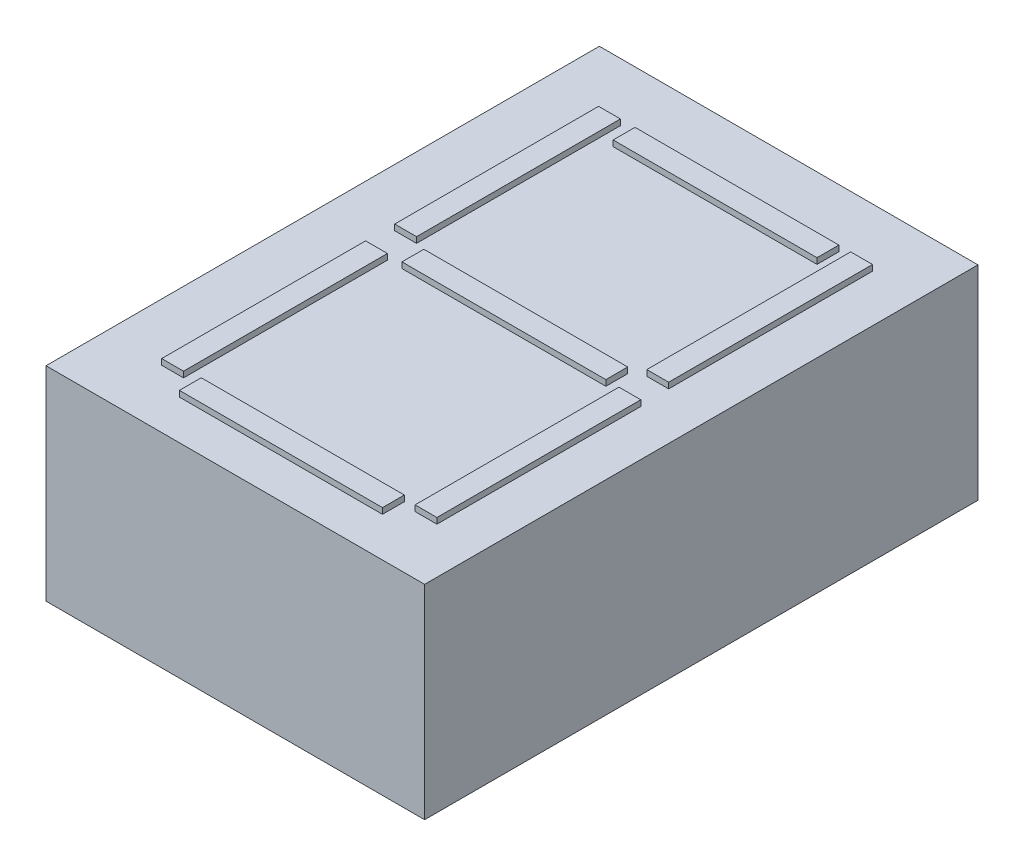
ISO-10303-21;
HEADER;
FILE_DESCRIPTION(('STEP AP214'),'2;1');
FILE_NAME('part.step','',(''),(''),'','','');
FILE_SCHEMA(('AUTOMOTIVE_DESIGN { 1 0 10303 214 1 1 1 1 }'));
ENDSEC;
DATA;
#1=APPLICATION_CONTEXT('core data for automotive mechanical design processes');
#2=APPLICATION_PROTOCOL_DEFINITION('international standard','automotive_design',2000,#1);
#3=PRODUCT_CONTEXT('',#1,'mechanical');
#4=PRODUCT('Part','Part','',(#3));
#5=PRODUCT_RELATED_PRODUCT_CATEGORY('part','',(#4));
#6=PRODUCT_DEFINITION_FORMATION('','',#4);
#7=PRODUCT_DEFINITION_CONTEXT('part definition',#1,'design');
#8=PRODUCT_DEFINITION('design','',#6,#7);
#9=PRODUCT_DEFINITION_SHAPE('','',#8);
#10=(LENGTH_UNIT() NAMED_UNIT(*) SI_UNIT(.MILLI.,.METRE.));
#11=(NAMED_UNIT(*) PLANE_ANGLE_UNIT() SI_UNIT($,.RADIAN.));
#12=(NAMED_UNIT(*) SI_UNIT($,.STERADIAN.) SOLID_ANGLE_UNIT());
#13=UNCERTAINTY_MEASURE_WITH_UNIT(LENGTH_MEASURE(1.E-05),#10,'distance_accuracy_value','');
#14=(GEOMETRIC_REPRESENTATION_CONTEXT(3) GLOBAL_UNCERTAINTY_ASSIGNED_CONTEXT((#13)) GLOBAL_UNIT_ASSIGNED_CONTEXT((#10,
#11,#12)) REPRESENTATION_CONTEXT('',''));
#15=CARTESIAN_POINT('',(0.,0.,0.));
#16=DIRECTION('',(0.,0.,1.));
#17=DIRECTION('',(1.,0.,0.));
#18=AXIS2_PLACEMENT_3D('',#15,#16,#17);
#19=CARTESIAN_POINT('',(0.,7.,0.));
#20=DIRECTION('',(0.,1.,0.));
#21=DIRECTION('',(0.,0.,1.));
#22=AXIS2_PLACEMENT_3D('',#19,#20,#21);
#23=PLANE('',#22);
#24=DIRECTION('',(0.,0.,1.));
#25=VECTOR('',#24,1.);
#26=CARTESIAN_POINT('',(0.,7.,-0.136469353779253));
#27=LINE('',#26,#25);
#28=CARTESIAN_POINT('',(0.,7.,-0.136469353779253));
#29=VERTEX_POINT('',#28);
#30=CARTESIAN_POINT('',(0.,7.,18.8635306462207));
#31=VERTEX_POINT('',#30);
#32=EDGE_CURVE('E447',#29,#31,#27,.T.);
#33=ORIENTED_EDGE('',*,*,#32,.T.);
#34=DIRECTION('',(1.,0.,0.));
#35=VECTOR('',#34,1.);
#36=CARTESIAN_POINT('',(0.,7.,18.8635306462207));
#37=LINE('',#36,#35);
#38=CARTESIAN_POINT('',(13.,7.,18.8635306462207));
#39=VERTEX_POINT('',#38);
#40=EDGE_CURVE('E450',#31,#39,#37,.T.);
#41=ORIENTED_EDGE('',*,*,#40,.T.);
#42=DIRECTION('',(0.,0.,-1.));
#43=VECTOR('',#42,1.);
#44=CARTESIAN_POINT('',(13.,7.,-0.136469353779253));
#45=LINE('',#44,#43);
#46=CARTESIAN_POINT('',(13.,7.,-0.136469353779253));
#47=VERTEX_POINT('',#46);
#48=EDGE_CURVE('E453',#39,#47,#45,.T.);
#49=ORIENTED_EDGE('',*,*,#48,.T.);
#50=DIRECTION('',(-1.,0.,0.));
#51=VECTOR('',#50,1.);
#52=CARTESIAN_POINT('',(0.,7.,-0.136469353779253));
#53=LINE('',#52,#51);
#54=EDGE_CURVE('E455',#47,#29,#53,.T.);
#55=ORIENTED_EDGE('',*,*,#54,.T.);
#56=EDGE_LOOP('',(#33,#41,#49,#55));
#57=FACE_BOUND('',#56,.T.);
#58=DIRECTION('',(1.,0.,0.));
#59=VECTOR('',#58,1.);
#60=CARTESIAN_POINT('',(3.22270214278411,7.,2.61353064622075));
#61=LINE('',#60,#59);
#62=CARTESIAN_POINT('',(3.22270214278411,7.,2.61353064622075));
#63=VERTEX_POINT('',#62);
#64=CARTESIAN_POINT('',(10.2227021427841,7.,2.61353064622075));
#65=VERTEX_POINT('',#64);
#66=EDGE_CURVE('E431',#63,#65,#61,.T.);
#67=ORIENTED_EDGE('',*,*,#66,.F.);
#68=DIRECTION('',(0.,0.,1.));
#69=VECTOR('',#68,1.);
#70=CARTESIAN_POINT('',(3.22270214278411,7.,1.86353064622075));
#71=LINE('',#70,#69);
#72=CARTESIAN_POINT('',(3.22270214278411,7.,1.86353064622075));
#73=VERTEX_POINT('',#72);
#74=EDGE_CURVE('E417',#73,#63,#71,.T.);
#75=ORIENTED_EDGE('',*,*,#74,.F.);
#76=DIRECTION('',(-1.,0.,0.));
#77=VECTOR('',#76,1.);
#78=CARTESIAN_POINT('',(3.22270214278411,7.,1.86353064622075));
#79=LINE('',#78,#77);
#80=CARTESIAN_POINT('',(10.2227021427841,7.,1.86353064622075));
#81=VERTEX_POINT('',#80);
#82=EDGE_CURVE('E422',#81,#73,#79,.T.);
#83=ORIENTED_EDGE('',*,*,#82,.F.);
#84=DIRECTION('',(0.,0.,-1.));
#85=VECTOR('',#84,1.);
#86=CARTESIAN_POINT('',(10.2227021427841,7.,1.86353064622075));
#87=LINE('',#86,#85);
#88=EDGE_CURVE('E433',#65,#81,#87,.T.);
#89=ORIENTED_EDGE('',*,*,#88,.F.);
#90=EDGE_LOOP('',(#67,#75,#83,#89));
#91=FACE_BOUND('',#90,.T.);
#92=DIRECTION('',(1.,0.,0.));
#93=VECTOR('',#92,1.);
#94=CARTESIAN_POINT('',(1.97270214278411,7.,8.86353064622075));
#95=LINE('',#94,#93);
#96=CARTESIAN_POINT('',(1.97270214278411,7.,8.86353064622075));
#97=VERTEX_POINT('',#96);
#98=CARTESIAN_POINT('',(2.72270214278411,7.,8.86353064622075));
#99=VERTEX_POINT('',#98);
#100=EDGE_CURVE('E402',#97,#99,#95,.T.);
#101=ORIENTED_EDGE('',*,*,#100,.F.);
#102=DIRECTION('',(0.,0.,1.));
#103=VECTOR('',#102,1.);
#104=CARTESIAN_POINT('',(1.97270214278411,7.,1.86353064622075));
#105=LINE('',#104,#103);
#106=CARTESIAN_POINT('',(1.97270214278411,7.,1.86353064622075));
#107=VERTEX_POINT('',#106);
#108=EDGE_CURVE('E388',#107,#97,#105,.T.);
#109=ORIENTED_EDGE('',*,*,#108,.F.);
#110=DIRECTION('',(-1.,0.,0.));
#111=VECTOR('',#110,1.);
#112=CARTESIAN_POINT('',(1.97270214278411,7.,1.86353064622075));
#113=LINE('',#112,#111);
#114=CARTESIAN_POINT('',(2.72270214278411,7.,1.86353064622075));
#115=VERTEX_POINT('',#114);
#116=EDGE_CURVE('E393',#115,#107,#113,.T.);
#117=ORIENTED_EDGE('',*,*,#116,.F.);
#118=DIRECTION('',(0.,0.,-1.));
#119=VECTOR('',#118,1.);
#120=CARTESIAN_POINT('',(2.72270214278411,7.,1.86353064622075));
#121=LINE('',#120,#119);
#122=EDGE_CURVE('E404',#99,#115,#121,.T.);
#123=ORIENTED_EDGE('',*,*,#122,.F.);
#124=EDGE_LOOP('',(#101,#109,#117,#123));
#125=FACE_BOUND('',#124,.T.);
#126=DIRECTION('',(1.,0.,0.));
#127=VECTOR('',#126,1.);
#128=CARTESIAN_POINT('',(10.6282511794807,7.,8.86353064622075));
#129=LINE('',#128,#127);
#130=CARTESIAN_POINT('',(10.6282511794807,7.,8.86353064622075));
#131=VERTEX_POINT('',#130);
#132=CARTESIAN_POINT('',(11.3782511794807,7.,8.86353064622075));
#133=VERTEX_POINT('',#132);
#134=EDGE_CURVE('E373',#131,#133,#129,.T.);
#135=ORIENTED_EDGE('',*,*,#134,.F.);
#136=DIRECTION('',(0.,0.,1.));
#137=VECTOR('',#136,1.);
#138=CARTESIAN_POINT('',(10.6282511794807,7.,1.86353064622075));
#139=LINE('',#138,#137);
#140=CARTESIAN_POINT('',(10.6282511794807,7.,1.86353064622075));
#141=VERTEX_POINT('',#140);
#142=EDGE_CURVE('E359',#141,#131,#139,.T.);
#143=ORIENTED_EDGE('',*,*,#142,.F.);
#144=DIRECTION('',(-1.,0.,0.));
#145=VECTOR('',#144,1.);
#146=CARTESIAN_POINT('',(10.6282511794807,7.,1.86353064622075));
#147=LINE('',#146,#145);
#148=CARTESIAN_POINT('',(11.3782511794807,7.,1.86353064622075));
#149=VERTEX_POINT('',#148);
#150=EDGE_CURVE('E364',#149,#141,#147,.T.);
#151=ORIENTED_EDGE('',*,*,#150,.F.);
#152=DIRECTION('',(0.,0.,-1.));
#153=VECTOR('',#152,1.);
#154=CARTESIAN_POINT('',(11.3782511794807,7.,1.86353064622075));
#155=LINE('',#154,#153);
#156=EDGE_CURVE('E375',#133,#149,#155,.T.);
#157=ORIENTED_EDGE('',*,*,#156,.F.);
#158=EDGE_LOOP('',(#135,#143,#151,#157));
#159=FACE_BOUND('',#158,.T.);
#160=DIRECTION('',(1.,0.,0.));
#161=VECTOR('',#160,1.);
#162=CARTESIAN_POINT('',(3.22270214278411,7.,9.86353064622075));
#163=LINE('',#162,#161);
#164=CARTESIAN_POINT('',(3.22270214278411,7.,9.86353064622075));
#165=VERTEX_POINT('',#164);
#166=CARTESIAN_POINT('',(10.2227021427841,7.,9.86353064622075));
#167=VERTEX_POINT('',#166);
#168=EDGE_CURVE('E344',#165,#167,#163,.T.);
#169=ORIENTED_EDGE('',*,*,#168,.F.);
#170=DIRECTION('',(0.,0.,1.));
#171=VECTOR('',#170,1.);
#172=CARTESIAN_POINT('',(3.22270214278411,7.,9.11353064622075));
#173=LINE('',#172,#171);
#174=CARTESIAN_POINT('',(3.22270214278411,7.,9.11353064622075));
#175=VERTEX_POINT('',#174);
#176=EDGE_CURVE('E330',#175,#165,#173,.T.);
#177=ORIENTED_EDGE('',*,*,#176,.F.);
#178=DIRECTION('',(-1.,0.,0.));
#179=VECTOR('',#178,1.);
#180=CARTESIAN_POINT('',(3.22270214278411,7.,9.11353064622075));
#181=LINE('',#180,#179);
#182=CARTESIAN_POINT('',(10.2227021427841,7.,9.11353064622075));
#183=VERTEX_POINT('',#182);
#184=EDGE_CURVE('E335',#183,#175,#181,.T.);
#185=ORIENTED_EDGE('',*,*,#184,.F.);
#186=DIRECTION('',(0.,0.,-1.));
#187=VECTOR('',#186,1.);
#188=CARTESIAN_POINT('',(10.2227021427841,7.,9.11353064622075));
#189=LINE('',#188,#187);
#190=EDGE_CURVE('E346',#167,#183,#189,.T.);
#191=ORIENTED_EDGE('',*,*,#190,.F.);
#192=EDGE_LOOP('',(#169,#177,#185,#191));
#193=FACE_BOUND('',#192,.T.);
#194=DIRECTION('',(-1.,0.,0.));
#195=VECTOR('',#194,1.);
#196=CARTESIAN_POINT('',(2.72270214278411,7.,9.86353064622075));
#197=LINE('',#196,#195);
#198=CARTESIAN_POINT('',(2.72270214278411,7.,9.86353064622075));
#199=VERTEX_POINT('',#198);
#200=CARTESIAN_POINT('',(1.97270214278411,7.,9.86353064622075));
#201=VERTEX_POINT('',#200);
#202=EDGE_CURVE('E315',#199,#201,#197,.T.);
#203=ORIENTED_EDGE('',*,*,#202,.F.);
#204=DIRECTION('',(0.,0.,-1.));
#205=VECTOR('',#204,1.);
#206=CARTESIAN_POINT('',(2.72270214278411,7.,9.86353064622075));
#207=LINE('',#206,#205);
#208=CARTESIAN_POINT('',(2.72270214278411,7.,16.8635306462208));
#209=VERTEX_POINT('',#208);
#210=EDGE_CURVE('E301',#209,#199,#207,.T.);
#211=ORIENTED_EDGE('',*,*,#210,.F.);
#212=DIRECTION('',(1.,0.,0.));
#213=VECTOR('',#212,1.);
#214=CARTESIAN_POINT('',(2.72270214278411,7.,16.8635306462208));
#215=LINE('',#214,#213);
#216=CARTESIAN_POINT('',(1.97270214278411,7.,16.8635306462208));
#217=VERTEX_POINT('',#216);
#218=EDGE_CURVE('E306',#217,#209,#215,.T.);
#219=ORIENTED_EDGE('',*,*,#218,.F.);
#220=DIRECTION('',(0.,0.,1.));
#221=VECTOR('',#220,1.);
#222=CARTESIAN_POINT('',(1.97270214278411,7.,9.86353064622075));
#223=LINE('',#222,#221);
#224=EDGE_CURVE('E317',#201,#217,#223,.T.);
#225=ORIENTED_EDGE('',*,*,#224,.F.);
#226=EDGE_LOOP('',(#203,#211,#219,#225));
#227=FACE_BOUND('',#226,.T.);
#228=DIRECTION('',(1.,0.,0.));
#229=VECTOR('',#228,1.);
#230=CARTESIAN_POINT('',(3.22270214278411,7.,17.505647722764));
#231=LINE('',#230,#229);
#232=CARTESIAN_POINT('',(3.22270214278411,7.,17.505647722764));
#233=VERTEX_POINT('',#232);
#234=CARTESIAN_POINT('',(10.1949748117781,7.,17.505647722764));
#235=VERTEX_POINT('',#234);
#236=EDGE_CURVE('E273',#233,#235,#231,.T.);
#237=ORIENTED_EDGE('',*,*,#236,.F.);
#238=DIRECTION('',(0.,0.,1.));
#239=VECTOR('',#238,1.);
#240=CARTESIAN_POINT('',(3.22270214278411,7.,16.755647722764));
#241=LINE('',#240,#239);
#242=CARTESIAN_POINT('',(3.22270214278411,7.,16.755647722764));
#243=VERTEX_POINT('',#242);
#244=EDGE_CURVE('E270',#243,#233,#241,.T.);
#245=ORIENTED_EDGE('',*,*,#244,.F.);
#246=DIRECTION('',(-1.,0.,0.));
#247=VECTOR('',#246,1.);
#248=CARTESIAN_POINT('',(3.22270214278411,7.,16.755647722764));
#249=LINE('',#248,#247);
#250=CARTESIAN_POINT('',(10.1949748117781,7.,16.755647722764));
#251=VERTEX_POINT('',#250);
#252=EDGE_CURVE('E282',#251,#243,#249,.T.);
#253=ORIENTED_EDGE('',*,*,#252,.F.);
#254=DIRECTION('',(0.,0.,-1.));
#255=VECTOR('',#254,1.);
#256=CARTESIAN_POINT('',(10.1949748117781,7.,16.755647722764));
#257=LINE('',#256,#255);
#258=EDGE_CURVE('E290',#235,#251,#257,.T.);
#259=ORIENTED_EDGE('',*,*,#258,.F.);
#260=EDGE_LOOP('',(#237,#245,#253,#259));
#261=FACE_BOUND('',#260,.T.);
#262=DIRECTION('',(1.,0.,0.));
#263=VECTOR('',#262,1.);
#264=CARTESIAN_POINT('',(10.6727021427841,7.,16.8635306462207));
#265=LINE('',#264,#263);
#266=CARTESIAN_POINT('',(10.6727021427841,7.,16.8635306462207));
#267=VERTEX_POINT('',#266);
#268=CARTESIAN_POINT('',(11.4227021427841,7.,16.8635306462207));
#269=VERTEX_POINT('',#268);
#270=EDGE_CURVE('E869',#267,#269,#265,.T.);
#271=ORIENTED_EDGE('',*,*,#270,.F.);
#272=DIRECTION('',(0.,0.,1.));
#273=VECTOR('',#272,1.);
#274=CARTESIAN_POINT('',(10.6727021427841,7.,9.86353064622075));
#275=LINE('',#274,#273);
#276=CARTESIAN_POINT('',(10.6727021427841,7.,9.86353064622075));
#277=VERTEX_POINT('',#276);
#278=EDGE_CURVE('E268',#277,#267,#275,.T.);
#279=ORIENTED_EDGE('',*,*,#278,.F.);
#280=DIRECTION('',(-1.,0.,0.));
#281=VECTOR('',#280,1.);
#282=CARTESIAN_POINT('',(10.6727021427841,7.,9.86353064622075));
#283=LINE('',#282,#281);
#284=CARTESIAN_POINT('',(11.4227021427841,7.,9.86353064622075));
#285=VERTEX_POINT('',#284);
#286=EDGE_CURVE('E264',#285,#277,#283,.T.);
#287=ORIENTED_EDGE('',*,*,#286,.F.);
#288=DIRECTION('',(0.,0.,-1.));
#289=VECTOR('',#288,1.);
#290=CARTESIAN_POINT('',(11.4227021427841,7.,9.86353064622075));
#291=LINE('',#290,#289);
#292=EDGE_CURVE('E866',#269,#285,#291,.T.);
#293=ORIENTED_EDGE('',*,*,#292,.F.);
#294=EDGE_LOOP('',(#271,#279,#287,#293));
#295=FACE_BOUND('',#294,.T.);
#296=ADVANCED_FACE('F35',(#57,#91,#125,#159,#193,#227,#261,#295),#23,.T.);
#297=CARTESIAN_POINT('',(0.,7.,-0.136469353779253));
#298=DIRECTION('',(1.,0.,0.));
#299=DIRECTION('',(0.,0.,-1.));
#300=AXIS2_PLACEMENT_3D('',#297,#298,#299);
#301=PLANE('',#300);
#302=DIRECTION('',(0.,0.,1.));
#303=VECTOR('',#302,1.);
#304=CARTESIAN_POINT('',(0.,0.,-0.136469353779253));
#305=LINE('',#304,#303);
#306=CARTESIAN_POINT('',(0.,0.,-0.136469353779253));
#307=VERTEX_POINT('',#306);
#308=CARTESIAN_POINT('',(0.,0.,18.8635306462207));
#309=VERTEX_POINT('',#308);
#310=EDGE_CURVE('E446',#307,#309,#305,.T.);
#311=ORIENTED_EDGE('',*,*,#310,.T.);
#312=DIRECTION('',(0.,-1.,0.));
#313=VECTOR('',#312,1.);
#314=CARTESIAN_POINT('',(0.,7.,18.8635306462207));
#315=LINE('',#314,#313);
#316=EDGE_CURVE('E11',#31,#309,#315,.T.);
#317=ORIENTED_EDGE('',*,*,#316,.F.);
#318=ORIENTED_EDGE('',*,*,#32,.F.);
#319=DIRECTION('',(0.,-1.,0.));
#320=VECTOR('',#319,1.);
#321=CARTESIAN_POINT('',(0.,7.,-0.136469353779253));
#322=LINE('',#321,#320);
#323=EDGE_CURVE('E457',#29,#307,#322,.T.);
#324=ORIENTED_EDGE('',*,*,#323,.T.);
#325=EDGE_LOOP('',(#311,#317,#318,#324));
#326=FACE_BOUND('',#325,.T.);
#327=ADVANCED_FACE('F37',(#326),#301,.F.);
#328=CARTESIAN_POINT('',(0.,7.,18.8635306462207));
#329=DIRECTION('',(0.,0.,-1.));
#330=DIRECTION('',(-1.,0.,0.));
#331=AXIS2_PLACEMENT_3D('',#328,#329,#330);
#332=PLANE('',#331);
#333=DIRECTION('',(1.,0.,0.));
#334=VECTOR('',#333,1.);
#335=CARTESIAN_POINT('',(0.,0.,18.8635306462207));
#336=LINE('',#335,#334);
#337=CARTESIAN_POINT('',(13.,0.,18.8635306462207));
#338=VERTEX_POINT('',#337);
#339=EDGE_CURVE('E460',#309,#338,#336,.T.);
#340=ORIENTED_EDGE('',*,*,#339,.T.);
#341=DIRECTION('',(0.,-1.,0.));
#342=VECTOR('',#341,1.);
#343=CARTESIAN_POINT('',(13.,7.,18.8635306462207));
#344=LINE('',#343,#342);
#345=EDGE_CURVE('E43',#39,#338,#344,.T.);
#346=ORIENTED_EDGE('',*,*,#345,.F.);
#347=ORIENTED_EDGE('',*,*,#40,.F.);
#348=ORIENTED_EDGE('',*,*,#316,.T.);
#349=EDGE_LOOP('',(#340,#346,#347,#348));
#350=FACE_BOUND('',#349,.T.);
#351=ADVANCED_FACE('F490',(#350),#332,.F.);
#352=CARTESIAN_POINT('',(13.,7.,-0.136469353779253));
#353=DIRECTION('',(-1.,0.,0.));
#354=DIRECTION('',(0.,0.,1.));
#355=AXIS2_PLACEMENT_3D('',#352,#353,#354);
#356=PLANE('',#355);
#357=DIRECTION('',(0.,0.,-1.));
#358=VECTOR('',#357,1.);
#359=CARTESIAN_POINT('',(13.,0.,-0.136469353779253));
#360=LINE('',#359,#358);
#361=CARTESIAN_POINT('',(13.,0.,-0.136469353779253));
#362=VERTEX_POINT('',#361);
#363=EDGE_CURVE('E462',#338,#362,#360,.T.);
#364=ORIENTED_EDGE('',*,*,#363,.T.);
#365=DIRECTION('',(0.,-1.,0.));
#366=VECTOR('',#365,1.);
#367=CARTESIAN_POINT('',(13.,7.,-0.136469353779253));
#368=LINE('',#367,#366);
#369=EDGE_CURVE('E467',#47,#362,#368,.T.);
#370=ORIENTED_EDGE('',*,*,#369,.F.);
#371=ORIENTED_EDGE('',*,*,#48,.F.);
#372=ORIENTED_EDGE('',*,*,#345,.T.);
#373=EDGE_LOOP('',(#364,#370,#371,#372));
#374=FACE_BOUND('',#373,.T.);
#375=ADVANCED_FACE('F474',(#374),#356,.F.);
#376=CARTESIAN_POINT('',(0.,7.,-0.136469353779253));
#377=DIRECTION('',(0.,0.,1.));
#378=DIRECTION('',(1.,0.,0.));
#379=AXIS2_PLACEMENT_3D('',#376,#377,#378);
#380=PLANE('',#379);
#381=DIRECTION('',(-1.,0.,0.));
#382=VECTOR('',#381,1.);
#383=CARTESIAN_POINT('',(0.,0.,-0.136469353779253));
#384=LINE('',#383,#382);
#385=EDGE_CURVE('E451',#362,#307,#384,.T.);
#386=ORIENTED_EDGE('',*,*,#385,.T.);
#387=ORIENTED_EDGE('',*,*,#323,.F.);
#388=ORIENTED_EDGE('',*,*,#54,.F.);
#389=ORIENTED_EDGE('',*,*,#369,.T.);
#390=EDGE_LOOP('',(#386,#387,#388,#389));
#391=FACE_BOUND('',#390,.T.);
#392=ADVANCED_FACE('F483',(#391),#380,.F.);
#393=CARTESIAN_POINT('',(0.,0.,0.));
#394=DIRECTION('',(0.,1.,0.));
#395=DIRECTION('',(0.,0.,1.));
#396=AXIS2_PLACEMENT_3D('',#393,#394,#395);
#397=PLANE('',#396);
#398=ORIENTED_EDGE('',*,*,#310,.F.);
#399=ORIENTED_EDGE('',*,*,#385,.F.);
#400=ORIENTED_EDGE('',*,*,#363,.F.);
#401=ORIENTED_EDGE('',*,*,#339,.F.);
#402=EDGE_LOOP('',(#398,#399,#400,#401));
#403=FACE_BOUND('',#402,.T.);
#404=ADVANCED_FACE('F480',(#403),#397,.F.);
#405=CARTESIAN_POINT('',(3.22270214278411,7.2,1.86353064622075));
#406=DIRECTION('',(1.,0.,0.));
#407=DIRECTION('',(0.,0.,-1.));
#408=AXIS2_PLACEMENT_3D('',#405,#406,#407);
#409=PLANE('',#408);
#410=ORIENTED_EDGE('',*,*,#74,.T.);
#411=DIRECTION('',(0.,-1.,0.));
#412=VECTOR('',#411,1.);
#413=CARTESIAN_POINT('',(3.22270214278411,7.2,2.61353064622075));
#414=LINE('',#413,#412);
#415=CARTESIAN_POINT('',(3.22270214278411,7.2,2.61353064622075));
#416=VERTEX_POINT('',#415);
#417=EDGE_CURVE('E444',#416,#63,#414,.T.);
#418=ORIENTED_EDGE('',*,*,#417,.F.);
#419=DIRECTION('',(0.,0.,1.));
#420=VECTOR('',#419,1.);
#421=CARTESIAN_POINT('',(3.22270214278411,7.2,1.86353064622075));
#422=LINE('',#421,#420);
#423=CARTESIAN_POINT('',(3.22270214278411,7.2,1.86353064622075));
#424=VERTEX_POINT('',#423);
#425=EDGE_CURVE('E418',#424,#416,#422,.T.);
#426=ORIENTED_EDGE('',*,*,#425,.F.);
#427=DIRECTION('',(0.,-1.,0.));
#428=VECTOR('',#427,1.);
#429=CARTESIAN_POINT('',(3.22270214278411,7.2,1.86353064622075));
#430=LINE('',#429,#428);
#431=EDGE_CURVE('E428',#424,#73,#430,.T.);
#432=ORIENTED_EDGE('',*,*,#431,.T.);
#433=EDGE_LOOP('',(#410,#418,#426,#432));
#434=FACE_BOUND('',#433,.T.);
#435=ADVANCED_FACE('F503',(#434),#409,.F.);
#436=CARTESIAN_POINT('',(3.22270214278411,7.2,2.61353064622075));
#437=DIRECTION('',(0.,0.,-1.));
#438=DIRECTION('',(-1.,0.,0.));
#439=AXIS2_PLACEMENT_3D('',#436,#437,#438);
#440=PLANE('',#439);
#441=ORIENTED_EDGE('',*,*,#66,.T.);
#442=DIRECTION('',(0.,-1.,0.));
#443=VECTOR('',#442,1.);
#444=CARTESIAN_POINT('',(10.2227021427841,7.2,2.61353064622075));
#445=LINE('',#444,#443);
#446=CARTESIAN_POINT('',(10.2227021427841,7.2,2.61353064622075));
#447=VERTEX_POINT('',#446);
#448=EDGE_CURVE('E441',#447,#65,#445,.T.);
#449=ORIENTED_EDGE('',*,*,#448,.F.);
#450=DIRECTION('',(1.,0.,0.));
#451=VECTOR('',#450,1.);
#452=CARTESIAN_POINT('',(3.22270214278411,7.2,2.61353064622075));
#453=LINE('',#452,#451);
#454=EDGE_CURVE('E421',#416,#447,#453,.T.);
#455=ORIENTED_EDGE('',*,*,#454,.F.);
#456=ORIENTED_EDGE('',*,*,#417,.T.);
#457=EDGE_LOOP('',(#441,#449,#455,#456));
#458=FACE_BOUND('',#457,.T.);
#459=ADVANCED_FACE('F528',(#458),#440,.F.);
#460=CARTESIAN_POINT('',(10.2227021427841,7.2,1.86353064622075));
#461=DIRECTION('',(-1.,0.,0.));
#462=DIRECTION('',(0.,0.,1.));
#463=AXIS2_PLACEMENT_3D('',#460,#461,#462);
#464=PLANE('',#463);
#465=ORIENTED_EDGE('',*,*,#88,.T.);
#466=DIRECTION('',(0.,-1.,0.));
#467=VECTOR('',#466,1.);
#468=CARTESIAN_POINT('',(10.2227021427841,7.2,1.86353064622075));
#469=LINE('',#468,#467);
#470=CARTESIAN_POINT('',(10.2227021427841,7.2,1.86353064622075));
#471=VERTEX_POINT('',#470);
#472=EDGE_CURVE('E439',#471,#81,#469,.T.);
#473=ORIENTED_EDGE('',*,*,#472,.F.);
#474=DIRECTION('',(0.,0.,-1.));
#475=VECTOR('',#474,1.);
#476=CARTESIAN_POINT('',(10.2227021427841,7.2,1.86353064622075));
#477=LINE('',#476,#475);
#478=EDGE_CURVE('E424',#447,#471,#477,.T.);
#479=ORIENTED_EDGE('',*,*,#478,.F.);
#480=ORIENTED_EDGE('',*,*,#448,.T.);
#481=EDGE_LOOP('',(#465,#473,#479,#480));
#482=FACE_BOUND('',#481,.T.);
#483=ADVANCED_FACE('F534',(#482),#464,.F.);
#484=CARTESIAN_POINT('',(3.22270214278411,7.2,1.86353064622075));
#485=DIRECTION('',(0.,0.,1.));
#486=DIRECTION('',(1.,0.,0.));
#487=AXIS2_PLACEMENT_3D('',#484,#485,#486);
#488=PLANE('',#487);
#489=ORIENTED_EDGE('',*,*,#82,.T.);
#490=ORIENTED_EDGE('',*,*,#431,.F.);
#491=DIRECTION('',(-1.,0.,0.));
#492=VECTOR('',#491,1.);
#493=CARTESIAN_POINT('',(3.22270214278411,7.2,1.86353064622075));
#494=LINE('',#493,#492);
#495=EDGE_CURVE('E426',#471,#424,#494,.T.);
#496=ORIENTED_EDGE('',*,*,#495,.F.);
#497=ORIENTED_EDGE('',*,*,#472,.T.);
#498=EDGE_LOOP('',(#489,#490,#496,#497));
#499=FACE_BOUND('',#498,.T.);
#500=ADVANCED_FACE('F541',(#499),#488,.F.);
#501=CARTESIAN_POINT('',(0.,7.2,0.));
#502=DIRECTION('',(0.,1.,0.));
#503=DIRECTION('',(0.,0.,1.));
#504=AXIS2_PLACEMENT_3D('',#501,#502,#503);
#505=PLANE('',#504);
#506=ORIENTED_EDGE('',*,*,#425,.T.);
#507=ORIENTED_EDGE('',*,*,#454,.T.);
#508=ORIENTED_EDGE('',*,*,#478,.T.);
#509=ORIENTED_EDGE('',*,*,#495,.T.);
#510=EDGE_LOOP('',(#506,#507,#508,#509));
#511=FACE_BOUND('',#510,.T.);
#512=ADVANCED_FACE('F549',(#511),#505,.T.);
#513=CARTESIAN_POINT('',(1.97270214278411,7.2,1.86353064622075));
#514=DIRECTION('',(1.,0.,0.));
#515=DIRECTION('',(0.,0.,-1.));
#516=AXIS2_PLACEMENT_3D('',#513,#514,#515);
#517=PLANE('',#516);
#518=ORIENTED_EDGE('',*,*,#108,.T.);
#519=DIRECTION('',(0.,-1.,0.));
#520=VECTOR('',#519,1.);
#521=CARTESIAN_POINT('',(1.97270214278411,7.2,8.86353064622075));
#522=LINE('',#521,#520);
#523=CARTESIAN_POINT('',(1.97270214278411,7.2,8.86353064622075));
#524=VERTEX_POINT('',#523);
#525=EDGE_CURVE('E415',#524,#97,#522,.T.);
#526=ORIENTED_EDGE('',*,*,#525,.F.);
#527=DIRECTION('',(0.,0.,1.));
#528=VECTOR('',#527,1.);
#529=CARTESIAN_POINT('',(1.97270214278411,7.2,1.86353064622075));
#530=LINE('',#529,#528);
#531=CARTESIAN_POINT('',(1.97270214278411,7.2,1.86353064622075));
#532=VERTEX_POINT('',#531);
#533=EDGE_CURVE('E389',#532,#524,#530,.T.);
#534=ORIENTED_EDGE('',*,*,#533,.F.);
#535=DIRECTION('',(0.,-1.,0.));
#536=VECTOR('',#535,1.);
#537=CARTESIAN_POINT('',(1.97270214278411,7.2,1.86353064622075));
#538=LINE('',#537,#536);
#539=EDGE_CURVE('E399',#532,#107,#538,.T.);
#540=ORIENTED_EDGE('',*,*,#539,.T.);
#541=EDGE_LOOP('',(#518,#526,#534,#540));
#542=FACE_BOUND('',#541,.T.);
#543=ADVANCED_FACE('F557',(#542),#517,.F.);
#544=CARTESIAN_POINT('',(1.97270214278411,7.2,8.86353064622075));
#545=DIRECTION('',(0.,0.,-1.));
#546=DIRECTION('',(-1.,0.,0.));
#547=AXIS2_PLACEMENT_3D('',#544,#545,#546);
#548=PLANE('',#547);
#549=ORIENTED_EDGE('',*,*,#100,.T.);
#550=DIRECTION('',(0.,-1.,0.));
#551=VECTOR('',#550,1.);
#552=CARTESIAN_POINT('',(2.72270214278411,7.2,8.86353064622075));
#553=LINE('',#552,#551);
#554=CARTESIAN_POINT('',(2.72270214278411,7.2,8.86353064622075));
#555=VERTEX_POINT('',#554);
#556=EDGE_CURVE('E412',#555,#99,#553,.T.);
#557=ORIENTED_EDGE('',*,*,#556,.F.);
#558=DIRECTION('',(1.,0.,0.));
#559=VECTOR('',#558,1.);
#560=CARTESIAN_POINT('',(1.97270214278411,7.2,8.86353064622075));
#561=LINE('',#560,#559);
#562=EDGE_CURVE('E392',#524,#555,#561,.T.);
#563=ORIENTED_EDGE('',*,*,#562,.F.);
#564=ORIENTED_EDGE('',*,*,#525,.T.);
#565=EDGE_LOOP('',(#549,#557,#563,#564));
#566=FACE_BOUND('',#565,.T.);
#567=ADVANCED_FACE('F565',(#566),#548,.F.);
#568=CARTESIAN_POINT('',(2.72270214278411,7.2,1.86353064622075));
#569=DIRECTION('',(-1.,0.,0.));
#570=DIRECTION('',(0.,0.,1.));
#571=AXIS2_PLACEMENT_3D('',#568,#569,#570);
#572=PLANE('',#571);
#573=ORIENTED_EDGE('',*,*,#122,.T.);
#574=DIRECTION('',(0.,-1.,0.));
#575=VECTOR('',#574,1.);
#576=CARTESIAN_POINT('',(2.72270214278411,7.2,1.86353064622075));
#577=LINE('',#576,#575);
#578=CARTESIAN_POINT('',(2.72270214278411,7.2,1.86353064622075));
#579=VERTEX_POINT('',#578);
#580=EDGE_CURVE('E410',#579,#115,#577,.T.);
#581=ORIENTED_EDGE('',*,*,#580,.F.);
#582=DIRECTION('',(0.,0.,-1.));
#583=VECTOR('',#582,1.);
#584=CARTESIAN_POINT('',(2.72270214278411,7.2,1.86353064622075));
#585=LINE('',#584,#583);
#586=EDGE_CURVE('E395',#555,#579,#585,.T.);
#587=ORIENTED_EDGE('',*,*,#586,.F.);
#588=ORIENTED_EDGE('',*,*,#556,.T.);
#589=EDGE_LOOP('',(#573,#581,#587,#588));
#590=FACE_BOUND('',#589,.T.);
#591=ADVANCED_FACE('F573',(#590),#572,.F.);
#592=CARTESIAN_POINT('',(1.97270214278411,7.2,1.86353064622075));
#593=DIRECTION('',(0.,0.,1.));
#594=DIRECTION('',(1.,0.,0.));
#595=AXIS2_PLACEMENT_3D('',#592,#593,#594);
#596=PLANE('',#595);
#597=ORIENTED_EDGE('',*,*,#116,.T.);
#598=ORIENTED_EDGE('',*,*,#539,.F.);
#599=DIRECTION('',(-1.,0.,0.));
#600=VECTOR('',#599,1.);
#601=CARTESIAN_POINT('',(1.97270214278411,7.2,1.86353064622075));
#602=LINE('',#601,#600);
#603=EDGE_CURVE('E397',#579,#532,#602,.T.);
#604=ORIENTED_EDGE('',*,*,#603,.F.);
#605=ORIENTED_EDGE('',*,*,#580,.T.);
#606=EDGE_LOOP('',(#597,#598,#604,#605));
#607=FACE_BOUND('',#606,.T.);
#608=ADVANCED_FACE('F581',(#607),#596,.F.);
#609=CARTESIAN_POINT('',(0.,7.2,0.));
#610=DIRECTION('',(0.,1.,0.));
#611=DIRECTION('',(0.,0.,1.));
#612=AXIS2_PLACEMENT_3D('',#609,#610,#611);
#613=PLANE('',#612);
#614=ORIENTED_EDGE('',*,*,#533,.T.);
#615=ORIENTED_EDGE('',*,*,#562,.T.);
#616=ORIENTED_EDGE('',*,*,#586,.T.);
#617=ORIENTED_EDGE('',*,*,#603,.T.);
#618=EDGE_LOOP('',(#614,#615,#616,#617));
#619=FACE_BOUND('',#618,.T.);
#620=ADVANCED_FACE('F589',(#619),#613,.T.);
#621=CARTESIAN_POINT('',(10.6282511794807,7.2,1.86353064622075));
#622=DIRECTION('',(1.,0.,0.));
#623=DIRECTION('',(0.,0.,-1.));
#624=AXIS2_PLACEMENT_3D('',#621,#622,#623);
#625=PLANE('',#624);
#626=ORIENTED_EDGE('',*,*,#142,.T.);
#627=DIRECTION('',(0.,-1.,0.));
#628=VECTOR('',#627,1.);
#629=CARTESIAN_POINT('',(10.6282511794807,7.2,8.86353064622075));
#630=LINE('',#629,#628);
#631=CARTESIAN_POINT('',(10.6282511794807,7.2,8.86353064622075));
#632=VERTEX_POINT('',#631);
#633=EDGE_CURVE('E386',#632,#131,#630,.T.);
#634=ORIENTED_EDGE('',*,*,#633,.F.);
#635=DIRECTION('',(0.,0.,1.));
#636=VECTOR('',#635,1.);
#637=CARTESIAN_POINT('',(10.6282511794807,7.2,1.86353064622075));
#638=LINE('',#637,#636);
#639=CARTESIAN_POINT('',(10.6282511794807,7.2,1.86353064622075));
#640=VERTEX_POINT('',#639);
#641=EDGE_CURVE('E360',#640,#632,#638,.T.);
#642=ORIENTED_EDGE('',*,*,#641,.F.);
#643=DIRECTION('',(0.,-1.,0.));
#644=VECTOR('',#643,1.);
#645=CARTESIAN_POINT('',(10.6282511794807,7.2,1.86353064622075));
#646=LINE('',#645,#644);
#647=EDGE_CURVE('E370',#640,#141,#646,.T.);
#648=ORIENTED_EDGE('',*,*,#647,.T.);
#649=EDGE_LOOP('',(#626,#634,#642,#648));
#650=FACE_BOUND('',#649,.T.);
#651=ADVANCED_FACE('F597',(#650),#625,.F.);
#652=CARTESIAN_POINT('',(10.6282511794807,7.2,8.86353064622075));
#653=DIRECTION('',(0.,0.,-1.));
#654=DIRECTION('',(-1.,0.,0.));
#655=AXIS2_PLACEMENT_3D('',#652,#653,#654);
#656=PLANE('',#655);
#657=ORIENTED_EDGE('',*,*,#134,.T.);
#658=DIRECTION('',(0.,-1.,0.));
#659=VECTOR('',#658,1.);
#660=CARTESIAN_POINT('',(11.3782511794807,7.2,8.86353064622075));
#661=LINE('',#660,#659);
#662=CARTESIAN_POINT('',(11.3782511794807,7.2,8.86353064622075));
#663=VERTEX_POINT('',#662);
#664=EDGE_CURVE('E383',#663,#133,#661,.T.);
#665=ORIENTED_EDGE('',*,*,#664,.F.);
#666=DIRECTION('',(1.,0.,0.));
#667=VECTOR('',#666,1.);
#668=CARTESIAN_POINT('',(10.6282511794807,7.2,8.86353064622075));
#669=LINE('',#668,#667);
#670=EDGE_CURVE('E363',#632,#663,#669,.T.);
#671=ORIENTED_EDGE('',*,*,#670,.F.);
#672=ORIENTED_EDGE('',*,*,#633,.T.);
#673=EDGE_LOOP('',(#657,#665,#671,#672));
#674=FACE_BOUND('',#673,.T.);
#675=ADVANCED_FACE('F605',(#674),#656,.F.);
#676=CARTESIAN_POINT('',(11.3782511794807,7.2,1.86353064622075));
#677=DIRECTION('',(-1.,0.,0.));
#678=DIRECTION('',(0.,0.,1.));
#679=AXIS2_PLACEMENT_3D('',#676,#677,#678);
#680=PLANE('',#679);
#681=ORIENTED_EDGE('',*,*,#156,.T.);
#682=DIRECTION('',(0.,-1.,0.));
#683=VECTOR('',#682,1.);
#684=CARTESIAN_POINT('',(11.3782511794807,7.2,1.86353064622075));
#685=LINE('',#684,#683);
#686=CARTESIAN_POINT('',(11.3782511794807,7.2,1.86353064622075));
#687=VERTEX_POINT('',#686);
#688=EDGE_CURVE('E381',#687,#149,#685,.T.);
#689=ORIENTED_EDGE('',*,*,#688,.F.);
#690=DIRECTION('',(0.,0.,-1.));
#691=VECTOR('',#690,1.);
#692=CARTESIAN_POINT('',(11.3782511794807,7.2,1.86353064622075));
#693=LINE('',#692,#691);
#694=EDGE_CURVE('E366',#663,#687,#693,.T.);
#695=ORIENTED_EDGE('',*,*,#694,.F.);
#696=ORIENTED_EDGE('',*,*,#664,.T.);
#697=EDGE_LOOP('',(#681,#689,#695,#696));
#698=FACE_BOUND('',#697,.T.);
#699=ADVANCED_FACE('F613',(#698),#680,.F.);
#700=CARTESIAN_POINT('',(10.6282511794807,7.2,1.86353064622075));
#701=DIRECTION('',(0.,0.,1.));
#702=DIRECTION('',(1.,0.,0.));
#703=AXIS2_PLACEMENT_3D('',#700,#701,#702);
#704=PLANE('',#703);
#705=ORIENTED_EDGE('',*,*,#150,.T.);
#706=ORIENTED_EDGE('',*,*,#647,.F.);
#707=DIRECTION('',(-1.,0.,0.));
#708=VECTOR('',#707,1.);
#709=CARTESIAN_POINT('',(10.6282511794807,7.2,1.86353064622075));
#710=LINE('',#709,#708);
#711=EDGE_CURVE('E368',#687,#640,#710,.T.);
#712=ORIENTED_EDGE('',*,*,#711,.F.);
#713=ORIENTED_EDGE('',*,*,#688,.T.);
#714=EDGE_LOOP('',(#705,#706,#712,#713));
#715=FACE_BOUND('',#714,.T.);
#716=ADVANCED_FACE('F621',(#715),#704,.F.);
#717=CARTESIAN_POINT('',(0.,7.2,0.));
#718=DIRECTION('',(0.,1.,0.));
#719=DIRECTION('',(0.,0.,1.));
#720=AXIS2_PLACEMENT_3D('',#717,#718,#719);
#721=PLANE('',#720);
#722=ORIENTED_EDGE('',*,*,#641,.T.);
#723=ORIENTED_EDGE('',*,*,#670,.T.);
#724=ORIENTED_EDGE('',*,*,#694,.T.);
#725=ORIENTED_EDGE('',*,*,#711,.T.);
#726=EDGE_LOOP('',(#722,#723,#724,#725));
#727=FACE_BOUND('',#726,.T.);
#728=ADVANCED_FACE('F629',(#727),#721,.T.);
#729=CARTESIAN_POINT('',(3.22270214278411,7.2,9.11353064622075));
#730=DIRECTION('',(1.,0.,0.));
#731=DIRECTION('',(0.,0.,-1.));
#732=AXIS2_PLACEMENT_3D('',#729,#730,#731);
#733=PLANE('',#732);
#734=ORIENTED_EDGE('',*,*,#176,.T.);
#735=DIRECTION('',(0.,-1.,0.));
#736=VECTOR('',#735,1.);
#737=CARTESIAN_POINT('',(3.22270214278411,7.2,9.86353064622075));
#738=LINE('',#737,#736);
#739=CARTESIAN_POINT('',(3.22270214278411,7.2,9.86353064622075));
#740=VERTEX_POINT('',#739);
#741=EDGE_CURVE('E357',#740,#165,#738,.T.);
#742=ORIENTED_EDGE('',*,*,#741,.F.);
#743=DIRECTION('',(0.,0.,1.));
#744=VECTOR('',#743,1.);
#745=CARTESIAN_POINT('',(3.22270214278411,7.2,9.11353064622075));
#746=LINE('',#745,#744);
#747=CARTESIAN_POINT('',(3.22270214278411,7.2,9.11353064622075));
#748=VERTEX_POINT('',#747);
#749=EDGE_CURVE('E331',#748,#740,#746,.T.);
#750=ORIENTED_EDGE('',*,*,#749,.F.);
#751=DIRECTION('',(0.,-1.,0.));
#752=VECTOR('',#751,1.);
#753=CARTESIAN_POINT('',(3.22270214278411,7.2,9.11353064622075));
#754=LINE('',#753,#752);
#755=EDGE_CURVE('E341',#748,#175,#754,.T.);
#756=ORIENTED_EDGE('',*,*,#755,.T.);
#757=EDGE_LOOP('',(#734,#742,#750,#756));
#758=FACE_BOUND('',#757,.T.);
#759=ADVANCED_FACE('F637',(#758),#733,.F.);
#760=CARTESIAN_POINT('',(3.22270214278411,7.2,9.86353064622075));
#761=DIRECTION('',(0.,0.,-1.));
#762=DIRECTION('',(-1.,0.,0.));
#763=AXIS2_PLACEMENT_3D('',#760,#761,#762);
#764=PLANE('',#763);
#765=ORIENTED_EDGE('',*,*,#168,.T.);
#766=DIRECTION('',(0.,-1.,0.));
#767=VECTOR('',#766,1.);
#768=CARTESIAN_POINT('',(10.2227021427841,7.2,9.86353064622075));
#769=LINE('',#768,#767);
#770=CARTESIAN_POINT('',(10.2227021427841,7.2,9.86353064622075));
#771=VERTEX_POINT('',#770);
#772=EDGE_CURVE('E354',#771,#167,#769,.T.);
#773=ORIENTED_EDGE('',*,*,#772,.F.);
#774=DIRECTION('',(1.,0.,0.));
#775=VECTOR('',#774,1.);
#776=CARTESIAN_POINT('',(3.22270214278411,7.2,9.86353064622075));
#777=LINE('',#776,#775);
#778=EDGE_CURVE('E334',#740,#771,#777,.T.);
#779=ORIENTED_EDGE('',*,*,#778,.F.);
#780=ORIENTED_EDGE('',*,*,#741,.T.);
#781=EDGE_LOOP('',(#765,#773,#779,#780));
#782=FACE_BOUND('',#781,.T.);
#783=ADVANCED_FACE('F645',(#782),#764,.F.);
#784=CARTESIAN_POINT('',(10.2227021427841,7.2,9.11353064622075));
#785=DIRECTION('',(-1.,0.,0.));
#786=DIRECTION('',(0.,0.,1.));
#787=AXIS2_PLACEMENT_3D('',#784,#785,#786);
#788=PLANE('',#787);
#789=ORIENTED_EDGE('',*,*,#190,.T.);
#790=DIRECTION('',(0.,-1.,0.));
#791=VECTOR('',#790,1.);
#792=CARTESIAN_POINT('',(10.2227021427841,7.2,9.11353064622075));
#793=LINE('',#792,#791);
#794=CARTESIAN_POINT('',(10.2227021427841,7.2,9.11353064622075));
#795=VERTEX_POINT('',#794);
#796=EDGE_CURVE('E352',#795,#183,#793,.T.);
#797=ORIENTED_EDGE('',*,*,#796,.F.);
#798=DIRECTION('',(0.,0.,-1.));
#799=VECTOR('',#798,1.);
#800=CARTESIAN_POINT('',(10.2227021427841,7.2,9.11353064622075));
#801=LINE('',#800,#799);
#802=EDGE_CURVE('E337',#771,#795,#801,.T.);
#803=ORIENTED_EDGE('',*,*,#802,.F.);
#804=ORIENTED_EDGE('',*,*,#772,.T.);
#805=EDGE_LOOP('',(#789,#797,#803,#804));
#806=FACE_BOUND('',#805,.T.);
#807=ADVANCED_FACE('F653',(#806),#788,.F.);
#808=CARTESIAN_POINT('',(3.22270214278411,7.2,9.11353064622075));
#809=DIRECTION('',(0.,0.,1.));
#810=DIRECTION('',(1.,0.,0.));
#811=AXIS2_PLACEMENT_3D('',#808,#809,#810);
#812=PLANE('',#811);
#813=ORIENTED_EDGE('',*,*,#184,.T.);
#814=ORIENTED_EDGE('',*,*,#755,.F.);
#815=DIRECTION('',(-1.,0.,0.));
#816=VECTOR('',#815,1.);
#817=CARTESIAN_POINT('',(3.22270214278411,7.2,9.11353064622075));
#818=LINE('',#817,#816);
#819=EDGE_CURVE('E339',#795,#748,#818,.T.);
#820=ORIENTED_EDGE('',*,*,#819,.F.);
#821=ORIENTED_EDGE('',*,*,#796,.T.);
#822=EDGE_LOOP('',(#813,#814,#820,#821));
#823=FACE_BOUND('',#822,.T.);
#824=ADVANCED_FACE('F661',(#823),#812,.F.);
#825=CARTESIAN_POINT('',(0.,7.2,0.));
#826=DIRECTION('',(0.,1.,0.));
#827=DIRECTION('',(0.,0.,1.));
#828=AXIS2_PLACEMENT_3D('',#825,#826,#827);
#829=PLANE('',#828);
#830=ORIENTED_EDGE('',*,*,#749,.T.);
#831=ORIENTED_EDGE('',*,*,#778,.T.);
#832=ORIENTED_EDGE('',*,*,#802,.T.);
#833=ORIENTED_EDGE('',*,*,#819,.T.);
#834=EDGE_LOOP('',(#830,#831,#832,#833));
#835=FACE_BOUND('',#834,.T.);
#836=ADVANCED_FACE('F669',(#835),#829,.T.);
#837=CARTESIAN_POINT('',(2.72270214278411,7.2,9.86353064622075));
#838=DIRECTION('',(-1.,0.,0.));
#839=DIRECTION('',(0.,0.,1.));
#840=AXIS2_PLACEMENT_3D('',#837,#838,#839);
#841=PLANE('',#840);
#842=ORIENTED_EDGE('',*,*,#210,.T.);
#843=DIRECTION('',(0.,-1.,0.));
#844=VECTOR('',#843,1.);
#845=CARTESIAN_POINT('',(2.72270214278411,7.2,9.86353064622075));
#846=LINE('',#845,#844);
#847=CARTESIAN_POINT('',(2.72270214278411,7.2,9.86353064622075));
#848=VERTEX_POINT('',#847);
#849=EDGE_CURVE('E328',#848,#199,#846,.T.);
#850=ORIENTED_EDGE('',*,*,#849,.F.);
#851=DIRECTION('',(0.,0.,-1.));
#852=VECTOR('',#851,1.);
#853=CARTESIAN_POINT('',(2.72270214278411,7.2,9.86353064622075));
#854=LINE('',#853,#852);
#855=CARTESIAN_POINT('',(2.72270214278411,7.2,16.8635306462208));
#856=VERTEX_POINT('',#855);
#857=EDGE_CURVE('E302',#856,#848,#854,.T.);
#858=ORIENTED_EDGE('',*,*,#857,.F.);
#859=DIRECTION('',(0.,-1.,0.));
#860=VECTOR('',#859,1.);
#861=CARTESIAN_POINT('',(2.72270214278411,7.2,16.8635306462208));
#862=LINE('',#861,#860);
#863=EDGE_CURVE('E312',#856,#209,#862,.T.);
#864=ORIENTED_EDGE('',*,*,#863,.T.);
#865=EDGE_LOOP('',(#842,#850,#858,#864));
#866=FACE_BOUND('',#865,.T.);
#867=ADVANCED_FACE('F677',(#866),#841,.F.);
#868=CARTESIAN_POINT('',(2.72270214278411,7.2,9.86353064622075));
#869=DIRECTION('',(0.,0.,1.));
#870=DIRECTION('',(1.,0.,0.));
#871=AXIS2_PLACEMENT_3D('',#868,#869,#870);
#872=PLANE('',#871);
#873=ORIENTED_EDGE('',*,*,#202,.T.);
#874=DIRECTION('',(0.,-1.,0.));
#875=VECTOR('',#874,1.);
#876=CARTESIAN_POINT('',(1.97270214278411,7.2,9.86353064622075));
#877=LINE('',#876,#875);
#878=CARTESIAN_POINT('',(1.97270214278411,7.2,9.86353064622075));
#879=VERTEX_POINT('',#878);
#880=EDGE_CURVE('E325',#879,#201,#877,.T.);
#881=ORIENTED_EDGE('',*,*,#880,.F.);
#882=DIRECTION('',(-1.,0.,0.));
#883=VECTOR('',#882,1.);
#884=CARTESIAN_POINT('',(2.72270214278411,7.2,9.86353064622075));
#885=LINE('',#884,#883);
#886=EDGE_CURVE('E305',#848,#879,#885,.T.);
#887=ORIENTED_EDGE('',*,*,#886,.F.);
#888=ORIENTED_EDGE('',*,*,#849,.T.);
#889=EDGE_LOOP('',(#873,#881,#887,#888));
#890=FACE_BOUND('',#889,.T.);
#891=ADVANCED_FACE('F685',(#890),#872,.F.);
#892=CARTESIAN_POINT('',(1.97270214278411,7.2,9.86353064622075));
#893=DIRECTION('',(1.,0.,0.));
#894=DIRECTION('',(0.,0.,-1.));
#895=AXIS2_PLACEMENT_3D('',#892,#893,#894);
#896=PLANE('',#895);
#897=ORIENTED_EDGE('',*,*,#224,.T.);
#898=DIRECTION('',(0.,-1.,0.));
#899=VECTOR('',#898,1.);
#900=CARTESIAN_POINT('',(1.97270214278411,7.2,16.8635306462208));
#901=LINE('',#900,#899);
#902=CARTESIAN_POINT('',(1.97270214278411,7.2,16.8635306462208));
#903=VERTEX_POINT('',#902);
#904=EDGE_CURVE('E323',#903,#217,#901,.T.);
#905=ORIENTED_EDGE('',*,*,#904,.F.);
#906=DIRECTION('',(0.,0.,1.));
#907=VECTOR('',#906,1.);
#908=CARTESIAN_POINT('',(1.97270214278411,7.2,9.86353064622075));
#909=LINE('',#908,#907);
#910=EDGE_CURVE('E308',#879,#903,#909,.T.);
#911=ORIENTED_EDGE('',*,*,#910,.F.);
#912=ORIENTED_EDGE('',*,*,#880,.T.);
#913=EDGE_LOOP('',(#897,#905,#911,#912));
#914=FACE_BOUND('',#913,.T.);
#915=ADVANCED_FACE('F693',(#914),#896,.F.);
#916=CARTESIAN_POINT('',(2.72270214278411,7.2,16.8635306462208));
#917=DIRECTION('',(0.,0.,-1.));
#918=DIRECTION('',(-1.,0.,0.));
#919=AXIS2_PLACEMENT_3D('',#916,#917,#918);
#920=PLANE('',#919);
#921=ORIENTED_EDGE('',*,*,#218,.T.);
#922=ORIENTED_EDGE('',*,*,#863,.F.);
#923=DIRECTION('',(1.,0.,0.));
#924=VECTOR('',#923,1.);
#925=CARTESIAN_POINT('',(2.72270214278411,7.2,16.8635306462208));
#926=LINE('',#925,#924);
#927=EDGE_CURVE('E310',#903,#856,#926,.T.);
#928=ORIENTED_EDGE('',*,*,#927,.F.);
#929=ORIENTED_EDGE('',*,*,#904,.T.);
#930=EDGE_LOOP('',(#921,#922,#928,#929));
#931=FACE_BOUND('',#930,.T.);
#932=ADVANCED_FACE('F701',(#931),#920,.F.);
#933=CARTESIAN_POINT('',(0.,7.2,0.));
#934=DIRECTION('',(0.,-1.,0.));
#935=DIRECTION('',(0.,0.,-1.));
#936=AXIS2_PLACEMENT_3D('',#933,#934,#935);
#937=PLANE('',#936);
#938=ORIENTED_EDGE('',*,*,#857,.T.);
#939=ORIENTED_EDGE('',*,*,#886,.T.);
#940=ORIENTED_EDGE('',*,*,#910,.T.);
#941=ORIENTED_EDGE('',*,*,#927,.T.);
#942=EDGE_LOOP('',(#938,#939,#940,#941));
#943=FACE_BOUND('',#942,.T.);
#944=ADVANCED_FACE('F709',(#943),#937,.F.);
#945=CARTESIAN_POINT('',(3.22270214278411,7.2,16.755647722764));
#946=DIRECTION('',(1.,0.,0.));
#947=DIRECTION('',(0.,0.,-1.));
#948=AXIS2_PLACEMENT_3D('',#945,#946,#947);
#949=PLANE('',#948);
#950=ORIENTED_EDGE('',*,*,#244,.T.);
#951=DIRECTION('',(0.,-1.,0.));
#952=VECTOR('',#951,1.);
#953=CARTESIAN_POINT('',(3.22270214278411,7.2,17.505647722764));
#954=LINE('',#953,#952);
#955=CARTESIAN_POINT('',(3.22270214278411,7.2,17.505647722764));
#956=VERTEX_POINT('',#955);
#957=EDGE_CURVE('E299',#956,#233,#954,.T.);
#958=ORIENTED_EDGE('',*,*,#957,.F.);
#959=DIRECTION('',(0.,0.,1.));
#960=VECTOR('',#959,1.);
#961=CARTESIAN_POINT('',(3.22270214278411,7.2,16.755647722764));
#962=LINE('',#961,#960);
#963=CARTESIAN_POINT('',(3.22270214278411,7.2,16.755647722764));
#964=VERTEX_POINT('',#963);
#965=EDGE_CURVE('E278',#964,#956,#962,.T.);
#966=ORIENTED_EDGE('',*,*,#965,.F.);
#967=DIRECTION('',(0.,-1.,0.));
#968=VECTOR('',#967,1.);
#969=CARTESIAN_POINT('',(3.22270214278411,7.2,16.755647722764));
#970=LINE('',#969,#968);
#971=EDGE_CURVE('E287',#964,#243,#970,.T.);
#972=ORIENTED_EDGE('',*,*,#971,.T.);
#973=EDGE_LOOP('',(#950,#958,#966,#972));
#974=FACE_BOUND('',#973,.T.);
#975=ADVANCED_FACE('F717',(#974),#949,.F.);
#976=CARTESIAN_POINT('',(3.22270214278411,7.2,17.505647722764));
#977=DIRECTION('',(0.,0.,-1.));
#978=DIRECTION('',(-1.,0.,0.));
#979=AXIS2_PLACEMENT_3D('',#976,#977,#978);
#980=PLANE('',#979);
#981=ORIENTED_EDGE('',*,*,#236,.T.);
#982=DIRECTION('',(0.,-1.,0.));
#983=VECTOR('',#982,1.);
#984=CARTESIAN_POINT('',(10.1949748117781,7.2,17.505647722764));
#985=LINE('',#984,#983);
#986=CARTESIAN_POINT('',(10.1949748117781,7.2,17.505647722764));
#987=VERTEX_POINT('',#986);
#988=EDGE_CURVE('E296',#987,#235,#985,.T.);
#989=ORIENTED_EDGE('',*,*,#988,.F.);
#990=DIRECTION('',(1.,0.,0.));
#991=VECTOR('',#990,1.);
#992=CARTESIAN_POINT('',(3.22270214278411,7.2,17.505647722764));
#993=LINE('',#992,#991);
#994=EDGE_CURVE('E281',#956,#987,#993,.T.);
#995=ORIENTED_EDGE('',*,*,#994,.F.);
#996=ORIENTED_EDGE('',*,*,#957,.T.);
#997=EDGE_LOOP('',(#981,#989,#995,#996));
#998=FACE_BOUND('',#997,.T.);
#999=ADVANCED_FACE('F725',(#998),#980,.F.);
#1000=CARTESIAN_POINT('',(10.1949748117781,7.2,16.755647722764));
#1001=DIRECTION('',(-1.,0.,0.));
#1002=DIRECTION('',(0.,0.,1.));
#1003=AXIS2_PLACEMENT_3D('',#1000,#1001,#1002);
#1004=PLANE('',#1003);
#1005=ORIENTED_EDGE('',*,*,#258,.T.);
#1006=DIRECTION('',(0.,-1.,0.));
#1007=VECTOR('',#1006,1.);
#1008=CARTESIAN_POINT('',(10.1949748117781,7.2,16.755647722764));
#1009=LINE('',#1008,#1007);
#1010=CARTESIAN_POINT('',(10.1949748117781,7.2,16.755647722764));
#1011=VERTEX_POINT('',#1010);
#1012=EDGE_CURVE('E58',#1011,#251,#1009,.T.);
#1013=ORIENTED_EDGE('',*,*,#1012,.F.);
#1014=DIRECTION('',(0.,0.,-1.));
#1015=VECTOR('',#1014,1.);
#1016=CARTESIAN_POINT('',(10.1949748117781,7.2,16.755647722764));
#1017=LINE('',#1016,#1015);
#1018=EDGE_CURVE('E284',#987,#1011,#1017,.T.);
#1019=ORIENTED_EDGE('',*,*,#1018,.F.);
#1020=ORIENTED_EDGE('',*,*,#988,.T.);
#1021=EDGE_LOOP('',(#1005,#1013,#1019,#1020));
#1022=FACE_BOUND('',#1021,.T.);
#1023=ADVANCED_FACE('F733',(#1022),#1004,.F.);
#1024=CARTESIAN_POINT('',(3.22270214278411,7.2,16.755647722764));
#1025=DIRECTION('',(0.,0.,1.));
#1026=DIRECTION('',(1.,0.,0.));
#1027=AXIS2_PLACEMENT_3D('',#1024,#1025,#1026);
#1028=PLANE('',#1027);
#1029=ORIENTED_EDGE('',*,*,#252,.T.);
#1030=ORIENTED_EDGE('',*,*,#971,.F.);
#1031=DIRECTION('',(-1.,0.,0.));
#1032=VECTOR('',#1031,1.);
#1033=CARTESIAN_POINT('',(3.22270214278411,7.2,16.755647722764));
#1034=LINE('',#1033,#1032);
#1035=EDGE_CURVE('E286',#1011,#964,#1034,.T.);
#1036=ORIENTED_EDGE('',*,*,#1035,.F.);
#1037=ORIENTED_EDGE('',*,*,#1012,.T.);
#1038=EDGE_LOOP('',(#1029,#1030,#1036,#1037));
#1039=FACE_BOUND('',#1038,.T.);
#1040=ADVANCED_FACE('F741',(#1039),#1028,.F.);
#1041=CARTESIAN_POINT('',(0.,7.2,0.));
#1042=DIRECTION('',(0.,1.,0.));
#1043=DIRECTION('',(0.,0.,1.));
#1044=AXIS2_PLACEMENT_3D('',#1041,#1042,#1043);
#1045=PLANE('',#1044);
#1046=ORIENTED_EDGE('',*,*,#965,.T.);
#1047=ORIENTED_EDGE('',*,*,#994,.T.);
#1048=ORIENTED_EDGE('',*,*,#1018,.T.);
#1049=ORIENTED_EDGE('',*,*,#1035,.T.);
#1050=EDGE_LOOP('',(#1046,#1047,#1048,#1049));
#1051=FACE_BOUND('',#1050,.T.);
#1052=ADVANCED_FACE('F749',(#1051),#1045,.T.);
#1053=CARTESIAN_POINT('',(10.6727021427841,7.2,9.86353064622075));
#1054=DIRECTION('',(1.,0.,0.));
#1055=DIRECTION('',(0.,0.,-1.));
#1056=AXIS2_PLACEMENT_3D('',#1053,#1054,#1055);
#1057=PLANE('',#1056);
#1058=ORIENTED_EDGE('',*,*,#278,.T.);
#1059=DIRECTION('',(0.,-1.,0.));
#1060=VECTOR('',#1059,1.);
#1061=CARTESIAN_POINT('',(10.6727021427841,7.2,16.8635306462207));
#1062=LINE('',#1061,#1060);
#1063=CARTESIAN_POINT('',(10.6727021427841,7.2,16.8635306462207));
#1064=VERTEX_POINT('',#1063);
#1065=EDGE_CURVE('E249',#1064,#267,#1062,.T.);
#1066=ORIENTED_EDGE('',*,*,#1065,.F.);
#1067=DIRECTION('',(0.,0.,1.));
#1068=VECTOR('',#1067,1.);
#1069=CARTESIAN_POINT('',(10.6727021427841,7.2,9.86353064622075));
#1070=LINE('',#1069,#1068);
#1071=CARTESIAN_POINT('',(10.6727021427841,7.2,9.86353064622075));
#1072=VERTEX_POINT('',#1071);
#1073=EDGE_CURVE('E256',#1072,#1064,#1070,.T.);
#1074=ORIENTED_EDGE('',*,*,#1073,.F.);
#1075=DIRECTION('',(0.,-1.,0.));
#1076=VECTOR('',#1075,1.);
#1077=CARTESIAN_POINT('',(10.6727021427841,7.2,9.86353064622075));
#1078=LINE('',#1077,#1076);
#1079=EDGE_CURVE('E863',#1072,#277,#1078,.T.);
#1080=ORIENTED_EDGE('',*,*,#1079,.T.);
#1081=EDGE_LOOP('',(#1058,#1066,#1074,#1080));
#1082=FACE_BOUND('',#1081,.T.);
#1083=ADVANCED_FACE('F266',(#1082),#1057,.F.);
#1084=CARTESIAN_POINT('',(10.6727021427841,7.2,16.8635306462207));
#1085=DIRECTION('',(0.,0.,-1.));
#1086=DIRECTION('',(-1.,0.,0.));
#1087=AXIS2_PLACEMENT_3D('',#1084,#1085,#1086);
#1088=PLANE('',#1087);
#1089=ORIENTED_EDGE('',*,*,#270,.T.);
#1090=DIRECTION('',(0.,-1.,0.));
#1091=VECTOR('',#1090,1.);
#1092=CARTESIAN_POINT('',(11.4227021427841,7.2,16.8635306462207));
#1093=LINE('',#1092,#1091);
#1094=CARTESIAN_POINT('',(11.4227021427841,7.2,16.8635306462207));
#1095=VERTEX_POINT('',#1094);
#1096=EDGE_CURVE('E252',#1095,#269,#1093,.T.);
#1097=ORIENTED_EDGE('',*,*,#1096,.F.);
#1098=DIRECTION('',(1.,0.,0.));
#1099=VECTOR('',#1098,1.);
#1100=CARTESIAN_POINT('',(10.6727021427841,7.2,16.8635306462207));
#1101=LINE('',#1100,#1099);
#1102=EDGE_CURVE('E245',#1064,#1095,#1101,.T.);
#1103=ORIENTED_EDGE('',*,*,#1102,.F.);
#1104=ORIENTED_EDGE('',*,*,#1065,.T.);
#1105=EDGE_LOOP('',(#1089,#1097,#1103,#1104));
#1106=FACE_BOUND('',#1105,.T.);
#1107=ADVANCED_FACE('F247',(#1106),#1088,.F.);
#1108=CARTESIAN_POINT('',(11.4227021427841,7.2,9.86353064622075));
#1109=DIRECTION('',(-1.,0.,0.));
#1110=DIRECTION('',(0.,0.,1.));
#1111=AXIS2_PLACEMENT_3D('',#1108,#1109,#1110);
#1112=PLANE('',#1111);
#1113=ORIENTED_EDGE('',*,*,#292,.T.);
#1114=DIRECTION('',(0.,-1.,0.));
#1115=VECTOR('',#1114,1.);
#1116=CARTESIAN_POINT('',(11.4227021427841,7.2,9.86353064622075));
#1117=LINE('',#1116,#1115);
#1118=CARTESIAN_POINT('',(11.4227021427841,7.2,9.86353064622075));
#1119=VERTEX_POINT('',#1118);
#1120=EDGE_CURVE('E50',#1119,#285,#1117,.T.);
#1121=ORIENTED_EDGE('',*,*,#1120,.F.);
#1122=DIRECTION('',(0.,0.,-1.));
#1123=VECTOR('',#1122,1.);
#1124=CARTESIAN_POINT('',(11.4227021427841,7.2,9.86353064622075));
#1125=LINE('',#1124,#1123);
#1126=EDGE_CURVE('E255',#1095,#1119,#1125,.T.);
#1127=ORIENTED_EDGE('',*,*,#1126,.F.);
#1128=ORIENTED_EDGE('',*,*,#1096,.T.);
#1129=EDGE_LOOP('',(#1113,#1121,#1127,#1128));
#1130=FACE_BOUND('',#1129,.T.);
#1131=ADVANCED_FACE('F769',(#1130),#1112,.F.);
#1132=CARTESIAN_POINT('',(10.6727021427841,7.2,9.86353064622075));
#1133=DIRECTION('',(0.,0.,1.));
#1134=DIRECTION('',(1.,0.,0.));
#1135=AXIS2_PLACEMENT_3D('',#1132,#1133,#1134);
#1136=PLANE('',#1135);
#1137=ORIENTED_EDGE('',*,*,#286,.T.);
#1138=ORIENTED_EDGE('',*,*,#1079,.F.);
#1139=DIRECTION('',(-1.,0.,0.));
#1140=VECTOR('',#1139,1.);
#1141=CARTESIAN_POINT('',(10.6727021427841,7.2,9.86353064622075));
#1142=LINE('',#1141,#1140);
#1143=EDGE_CURVE('E260',#1119,#1072,#1142,.T.);
#1144=ORIENTED_EDGE('',*,*,#1143,.F.);
#1145=ORIENTED_EDGE('',*,*,#1120,.T.);
#1146=EDGE_LOOP('',(#1137,#1138,#1144,#1145));
#1147=FACE_BOUND('',#1146,.T.);
#1148=ADVANCED_FACE('F776',(#1147),#1136,.F.);
#1149=CARTESIAN_POINT('',(0.,7.2,0.));
#1150=DIRECTION('',(0.,1.,0.));
#1151=DIRECTION('',(0.,0.,1.));
#1152=AXIS2_PLACEMENT_3D('',#1149,#1150,#1151);
#1153=PLANE('',#1152);
#1154=ORIENTED_EDGE('',*,*,#1073,.T.);
#1155=ORIENTED_EDGE('',*,*,#1102,.T.);
#1156=ORIENTED_EDGE('',*,*,#1126,.T.);
#1157=ORIENTED_EDGE('',*,*,#1143,.T.);
#1158=EDGE_LOOP('',(#1154,#1155,#1156,#1157));
#1159=FACE_BOUND('',#1158,.T.);
#1160=ADVANCED_FACE('F259',(#1159),#1153,.T.);
#1161=CLOSED_SHELL('',(#296,#327,#351,#375,#392,#404,#435,#459,#483,#500,#512,#543,#567,#591,
#608,#620,#651,#675,#699,#716,#728,#759,#783,#807,#824,#836,#867,#891,#915,#932,#944,#975,#999,
#1023,#1040,#1052,#1083,#1107,#1131,#1148,#1160));
#1162=MANIFOLD_SOLID_BREP('B2',#1161);
#1163=ADVANCED_BREP_SHAPE_REPRESENTATION('',(#18,#1162),#14);
#1164=SHAPE_DEFINITION_REPRESENTATION(#9,#1163);
ENDSEC;
END-ISO-10303-21;
